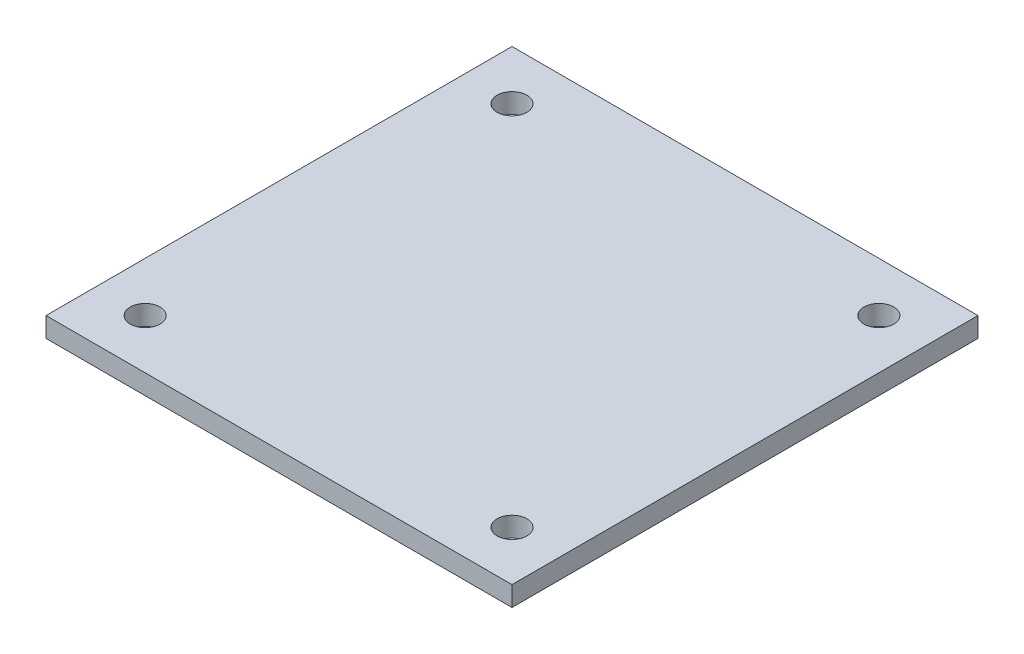
ISO-10303-21;
HEADER;
FILE_DESCRIPTION(('STEP AP214'),'2;1');
FILE_NAME('part.step','',(''),(''),'','','');
FILE_SCHEMA(('AUTOMOTIVE_DESIGN { 1 0 10303 214 1 1 1 1 }'));
ENDSEC;
DATA;
#1=APPLICATION_CONTEXT('core data for automotive mechanical design processes');
#2=APPLICATION_PROTOCOL_DEFINITION('international standard','automotive_design',2000,#1);
#3=PRODUCT_CONTEXT('',#1,'mechanical');
#4=PRODUCT('Part','Part','',(#3));
#5=PRODUCT_RELATED_PRODUCT_CATEGORY('part','',(#4));
#6=PRODUCT_DEFINITION_FORMATION('','',#4);
#7=PRODUCT_DEFINITION_CONTEXT('part definition',#1,'design');
#8=PRODUCT_DEFINITION('design','',#6,#7);
#9=PRODUCT_DEFINITION_SHAPE('','',#8);
#10=(LENGTH_UNIT() NAMED_UNIT(*) SI_UNIT(.MILLI.,.METRE.));
#11=(NAMED_UNIT(*) PLANE_ANGLE_UNIT() SI_UNIT($,.RADIAN.));
#12=(NAMED_UNIT(*) SI_UNIT($,.STERADIAN.) SOLID_ANGLE_UNIT());
#13=UNCERTAINTY_MEASURE_WITH_UNIT(LENGTH_MEASURE(1.E-05),#10,'distance_accuracy_value','');
#14=(GEOMETRIC_REPRESENTATION_CONTEXT(3) GLOBAL_UNCERTAINTY_ASSIGNED_CONTEXT((#13)) GLOBAL_UNIT_ASSIGNED_CONTEXT((#10,
#11,#12)) REPRESENTATION_CONTEXT('',''));
#15=CARTESIAN_POINT('',(0.,0.,0.));
#16=DIRECTION('',(0.,0.,1.));
#17=DIRECTION('',(1.,0.,0.));
#18=AXIS2_PLACEMENT_3D('',#15,#16,#17);
#19=CARTESIAN_POINT('',(-117.5,10.,-117.5));
#20=DIRECTION('',(1.,0.,0.));
#21=DIRECTION('',(0.,0.,-1.));
#22=AXIS2_PLACEMENT_3D('',#19,#20,#21);
#23=PLANE('',#22);
#24=DIRECTION('',(0.,0.,1.));
#25=VECTOR('',#24,1.);
#26=CARTESIAN_POINT('',(-117.5,0.,-117.5));
#27=LINE('',#26,#25);
#28=CARTESIAN_POINT('',(-117.5,0.,-117.5));
#29=VERTEX_POINT('',#28);
#30=CARTESIAN_POINT('',(-117.5,0.,117.5));
#31=VERTEX_POINT('',#30);
#32=EDGE_CURVE('E96',#29,#31,#27,.T.);
#33=ORIENTED_EDGE('',*,*,#32,.T.);
#34=DIRECTION('',(0.,-1.,0.));
#35=VECTOR('',#34,1.);
#36=CARTESIAN_POINT('',(-117.5,10.,117.5));
#37=LINE('',#36,#35);
#38=CARTESIAN_POINT('',(-117.5,10.,117.5));
#39=VERTEX_POINT('',#38);
#40=EDGE_CURVE('E11',#39,#31,#37,.T.);
#41=ORIENTED_EDGE('',*,*,#40,.F.);
#42=DIRECTION('',(0.,0.,1.));
#43=VECTOR('',#42,1.);
#44=CARTESIAN_POINT('',(-117.5,10.,-117.5));
#45=LINE('',#44,#43);
#46=CARTESIAN_POINT('',(-117.5,10.,-117.5));
#47=VERTEX_POINT('',#46);
#48=EDGE_CURVE('E84',#47,#39,#45,.T.);
#49=ORIENTED_EDGE('',*,*,#48,.F.);
#50=DIRECTION('',(0.,-1.,0.));
#51=VECTOR('',#50,1.);
#52=CARTESIAN_POINT('',(-117.5,10.,-117.5));
#53=LINE('',#52,#51);
#54=EDGE_CURVE('E92',#47,#29,#53,.T.);
#55=ORIENTED_EDGE('',*,*,#54,.T.);
#56=EDGE_LOOP('',(#33,#41,#49,#55));
#57=FACE_BOUND('',#56,.T.);
#58=ADVANCED_FACE('F33',(#57),#23,.F.);
#59=CARTESIAN_POINT('',(-117.5,10.,117.5));
#60=DIRECTION('',(0.,0.,-1.));
#61=DIRECTION('',(-1.,0.,0.));
#62=AXIS2_PLACEMENT_3D('',#59,#60,#61);
#63=PLANE('',#62);
#64=DIRECTION('',(1.,0.,0.));
#65=VECTOR('',#64,1.);
#66=CARTESIAN_POINT('',(-117.5,0.,117.5));
#67=LINE('',#66,#65);
#68=CARTESIAN_POINT('',(117.5,0.,117.5));
#69=VERTEX_POINT('',#68);
#70=EDGE_CURVE('E88',#31,#69,#67,.T.);
#71=ORIENTED_EDGE('',*,*,#70,.T.);
#72=DIRECTION('',(0.,-1.,0.));
#73=VECTOR('',#72,1.);
#74=CARTESIAN_POINT('',(117.5,10.,117.5));
#75=LINE('',#74,#73);
#76=CARTESIAN_POINT('',(117.5,10.,117.5));
#77=VERTEX_POINT('',#76);
#78=EDGE_CURVE('E41',#77,#69,#75,.T.);
#79=ORIENTED_EDGE('',*,*,#78,.F.);
#80=DIRECTION('',(1.,0.,0.));
#81=VECTOR('',#80,1.);
#82=CARTESIAN_POINT('',(-117.5,10.,117.5));
#83=LINE('',#82,#81);
#84=EDGE_CURVE('E79',#39,#77,#83,.T.);
#85=ORIENTED_EDGE('',*,*,#84,.F.);
#86=ORIENTED_EDGE('',*,*,#40,.T.);
#87=EDGE_LOOP('',(#71,#79,#85,#86));
#88=FACE_BOUND('',#87,.T.);
#89=ADVANCED_FACE('F87',(#88),#63,.F.);
#90=CARTESIAN_POINT('',(117.5,10.,-117.5));
#91=DIRECTION('',(-1.,0.,0.));
#92=DIRECTION('',(0.,0.,1.));
#93=AXIS2_PLACEMENT_3D('',#90,#91,#92);
#94=PLANE('',#93);
#95=DIRECTION('',(0.,0.,-1.));
#96=VECTOR('',#95,1.);
#97=CARTESIAN_POINT('',(117.5,0.,-117.5));
#98=LINE('',#97,#96);
#99=CARTESIAN_POINT('',(117.5,0.,-117.5));
#100=VERTEX_POINT('',#99);
#101=EDGE_CURVE('E66',#69,#100,#98,.T.);
#102=ORIENTED_EDGE('',*,*,#101,.T.);
#103=DIRECTION('',(0.,-1.,0.));
#104=VECTOR('',#103,1.);
#105=CARTESIAN_POINT('',(117.5,10.,-117.5));
#106=LINE('',#105,#104);
#107=CARTESIAN_POINT('',(117.5,10.,-117.5));
#108=VERTEX_POINT('',#107);
#109=EDGE_CURVE('E89',#108,#100,#106,.T.);
#110=ORIENTED_EDGE('',*,*,#109,.F.);
#111=DIRECTION('',(0.,0.,-1.));
#112=VECTOR('',#111,1.);
#113=CARTESIAN_POINT('',(117.5,10.,-117.5));
#114=LINE('',#113,#112);
#115=EDGE_CURVE('E82',#77,#108,#114,.T.);
#116=ORIENTED_EDGE('',*,*,#115,.F.);
#117=ORIENTED_EDGE('',*,*,#78,.T.);
#118=EDGE_LOOP('',(#102,#110,#116,#117));
#119=FACE_BOUND('',#118,.T.);
#120=ADVANCED_FACE('F90',(#119),#94,.F.);
#121=CARTESIAN_POINT('',(-117.5,10.,-117.5));
#122=DIRECTION('',(0.,0.,1.));
#123=DIRECTION('',(1.,0.,0.));
#124=AXIS2_PLACEMENT_3D('',#121,#122,#123);
#125=PLANE('',#124);
#126=DIRECTION('',(-1.,0.,0.));
#127=VECTOR('',#126,1.);
#128=CARTESIAN_POINT('',(-117.5,0.,-117.5));
#129=LINE('',#128,#127);
#130=EDGE_CURVE('E72',#100,#29,#129,.T.);
#131=ORIENTED_EDGE('',*,*,#130,.T.);
#132=ORIENTED_EDGE('',*,*,#54,.F.);
#133=DIRECTION('',(-1.,0.,0.));
#134=VECTOR('',#133,1.);
#135=CARTESIAN_POINT('',(-117.5,10.,-117.5));
#136=LINE('',#135,#134);
#137=EDGE_CURVE('E49',#108,#47,#136,.T.);
#138=ORIENTED_EDGE('',*,*,#137,.F.);
#139=ORIENTED_EDGE('',*,*,#109,.T.);
#140=EDGE_LOOP('',(#131,#132,#138,#139));
#141=FACE_BOUND('',#140,.T.);
#142=ADVANCED_FACE('F104',(#141),#125,.F.);
#143=CARTESIAN_POINT('',(0.,10.,0.));
#144=DIRECTION('',(0.,1.,0.));
#145=DIRECTION('',(0.,0.,1.));
#146=AXIS2_PLACEMENT_3D('',#143,#144,#145);
#147=PLANE('',#146);
#148=CARTESIAN_POINT('',(92.5,10.,-92.5));
#149=DIRECTION('',(0.,1.,0.));
#150=DIRECTION('',(0.,0.,1.));
#151=AXIS2_PLACEMENT_3D('',#148,#149,#150);
#152=CIRCLE('',#151,7.50000000000001);
#153=CARTESIAN_POINT('',(92.5,10.,-85.));
#154=VERTEX_POINT('',#153);
#155=EDGE_CURVE('E116',#154,#154,#152,.T.);
#156=ORIENTED_EDGE('',*,*,#155,.F.);
#157=EDGE_LOOP('',(#156));
#158=FACE_BOUND('',#157,.T.);
#159=CARTESIAN_POINT('',(92.5,10.,92.5));
#160=DIRECTION('',(0.,1.,0.));
#161=DIRECTION('',(0.,0.,1.));
#162=AXIS2_PLACEMENT_3D('',#159,#160,#161);
#163=CIRCLE('',#162,7.50000000000001);
#164=CARTESIAN_POINT('',(92.5,10.,100.));
#165=VERTEX_POINT('',#164);
#166=EDGE_CURVE('E122',#165,#165,#163,.T.);
#167=ORIENTED_EDGE('',*,*,#166,.F.);
#168=EDGE_LOOP('',(#167));
#169=FACE_BOUND('',#168,.T.);
#170=CARTESIAN_POINT('',(-92.5,10.,92.5));
#171=DIRECTION('',(0.,1.,0.));
#172=DIRECTION('',(0.,0.,1.));
#173=AXIS2_PLACEMENT_3D('',#170,#171,#172);
#174=CIRCLE('',#173,7.50000000000001);
#175=CARTESIAN_POINT('',(-92.5,10.,100.));
#176=VERTEX_POINT('',#175);
#177=EDGE_CURVE('E128',#176,#176,#174,.T.);
#178=ORIENTED_EDGE('',*,*,#177,.F.);
#179=EDGE_LOOP('',(#178));
#180=FACE_BOUND('',#179,.T.);
#181=CARTESIAN_POINT('',(-92.5,10.,-92.5));
#182=DIRECTION('',(0.,1.,0.));
#183=DIRECTION('',(0.,0.,1.));
#184=AXIS2_PLACEMENT_3D('',#181,#182,#183);
#185=CIRCLE('',#184,7.50000000000001);
#186=CARTESIAN_POINT('',(-92.5,10.,-85.));
#187=VERTEX_POINT('',#186);
#188=EDGE_CURVE('E110',#187,#187,#185,.T.);
#189=ORIENTED_EDGE('',*,*,#188,.F.);
#190=EDGE_LOOP('',(#189));
#191=FACE_BOUND('',#190,.T.);
#192=ORIENTED_EDGE('',*,*,#48,.T.);
#193=ORIENTED_EDGE('',*,*,#84,.T.);
#194=ORIENTED_EDGE('',*,*,#115,.T.);
#195=ORIENTED_EDGE('',*,*,#137,.T.);
#196=EDGE_LOOP('',(#192,#193,#194,#195));
#197=FACE_BOUND('',#196,.T.);
#198=ADVANCED_FACE('F80',(#158,#169,#180,#191,#197),#147,.T.);
#199=CARTESIAN_POINT('',(0.,0.,0.));
#200=DIRECTION('',(0.,1.,0.));
#201=DIRECTION('',(0.,0.,1.));
#202=AXIS2_PLACEMENT_3D('',#199,#200,#201);
#203=PLANE('',#202);
#204=CARTESIAN_POINT('',(92.5,0.,-92.5));
#205=DIRECTION('',(0.,1.,0.));
#206=DIRECTION('',(0.,0.,1.));
#207=AXIS2_PLACEMENT_3D('',#204,#205,#206);
#208=CIRCLE('',#207,7.50000000000001);
#209=CARTESIAN_POINT('',(92.5,0.,-85.));
#210=VERTEX_POINT('',#209);
#211=EDGE_CURVE('E119',#210,#210,#208,.T.);
#212=ORIENTED_EDGE('',*,*,#211,.T.);
#213=EDGE_LOOP('',(#212));
#214=FACE_BOUND('',#213,.T.);
#215=CARTESIAN_POINT('',(92.5,0.,92.5));
#216=DIRECTION('',(0.,1.,0.));
#217=DIRECTION('',(0.,0.,1.));
#218=AXIS2_PLACEMENT_3D('',#215,#216,#217);
#219=CIRCLE('',#218,7.50000000000001);
#220=CARTESIAN_POINT('',(92.5,0.,100.));
#221=VERTEX_POINT('',#220);
#222=EDGE_CURVE('E125',#221,#221,#219,.T.);
#223=ORIENTED_EDGE('',*,*,#222,.T.);
#224=EDGE_LOOP('',(#223));
#225=FACE_BOUND('',#224,.T.);
#226=CARTESIAN_POINT('',(-92.5,0.,92.5));
#227=DIRECTION('',(0.,1.,0.));
#228=DIRECTION('',(0.,0.,1.));
#229=AXIS2_PLACEMENT_3D('',#226,#227,#228);
#230=CIRCLE('',#229,7.50000000000001);
#231=CARTESIAN_POINT('',(-92.5,0.,100.));
#232=VERTEX_POINT('',#231);
#233=EDGE_CURVE('E113',#232,#232,#230,.T.);
#234=ORIENTED_EDGE('',*,*,#233,.T.);
#235=EDGE_LOOP('',(#234));
#236=FACE_BOUND('',#235,.T.);
#237=CARTESIAN_POINT('',(-92.5,0.,-92.5));
#238=DIRECTION('',(0.,1.,0.));
#239=DIRECTION('',(0.,0.,1.));
#240=AXIS2_PLACEMENT_3D('',#237,#238,#239);
#241=CIRCLE('',#240,7.50000000000001);
#242=CARTESIAN_POINT('',(-92.5,0.,-85.));
#243=VERTEX_POINT('',#242);
#244=EDGE_CURVE('E99',#243,#243,#241,.T.);
#245=ORIENTED_EDGE('',*,*,#244,.T.);
#246=EDGE_LOOP('',(#245));
#247=FACE_BOUND('',#246,.T.);
#248=ORIENTED_EDGE('',*,*,#32,.F.);
#249=ORIENTED_EDGE('',*,*,#130,.F.);
#250=ORIENTED_EDGE('',*,*,#101,.F.);
#251=ORIENTED_EDGE('',*,*,#70,.F.);
#252=EDGE_LOOP('',(#248,#249,#250,#251));
#253=FACE_BOUND('',#252,.T.);
#254=ADVANCED_FACE('F107',(#214,#225,#236,#247,#253),#203,.F.);
#255=CARTESIAN_POINT('',(-92.5,0.,-92.5));
#256=DIRECTION('',(0.,1.,0.));
#257=DIRECTION('',(0.,0.,1.));
#258=AXIS2_PLACEMENT_3D('',#255,#256,#257);
#259=CYLINDRICAL_SURFACE('',#258,7.50000000000001);
#260=ORIENTED_EDGE('',*,*,#244,.F.);
#261=EDGE_LOOP('',(#260));
#262=FACE_BOUND('',#261,.T.);
#263=ORIENTED_EDGE('',*,*,#188,.T.);
#264=EDGE_LOOP('',(#263));
#265=FACE_BOUND('',#264,.T.);
#266=ADVANCED_FACE('F140',(#262,#265),#259,.F.);
#267=CARTESIAN_POINT('',(-92.5,0.,92.5));
#268=DIRECTION('',(0.,1.,0.));
#269=DIRECTION('',(0.,0.,1.));
#270=AXIS2_PLACEMENT_3D('',#267,#268,#269);
#271=CYLINDRICAL_SURFACE('',#270,7.50000000000001);
#272=ORIENTED_EDGE('',*,*,#233,.F.);
#273=EDGE_LOOP('',(#272));
#274=FACE_BOUND('',#273,.T.);
#275=ORIENTED_EDGE('',*,*,#177,.T.);
#276=EDGE_LOOP('',(#275));
#277=FACE_BOUND('',#276,.T.);
#278=ADVANCED_FACE('F136',(#274,#277),#271,.F.);
#279=CARTESIAN_POINT('',(92.5,0.,92.5));
#280=DIRECTION('',(0.,1.,0.));
#281=DIRECTION('',(0.,0.,1.));
#282=AXIS2_PLACEMENT_3D('',#279,#280,#281);
#283=CYLINDRICAL_SURFACE('',#282,7.50000000000001);
#284=ORIENTED_EDGE('',*,*,#222,.F.);
#285=EDGE_LOOP('',(#284));
#286=FACE_BOUND('',#285,.T.);
#287=ORIENTED_EDGE('',*,*,#166,.T.);
#288=EDGE_LOOP('',(#287));
#289=FACE_BOUND('',#288,.T.);
#290=ADVANCED_FACE('F139',(#286,#289),#283,.F.);
#291=CARTESIAN_POINT('',(92.5,0.,-92.5));
#292=DIRECTION('',(0.,1.,0.));
#293=DIRECTION('',(0.,0.,1.));
#294=AXIS2_PLACEMENT_3D('',#291,#292,#293);
#295=CYLINDRICAL_SURFACE('',#294,7.50000000000001);
#296=ORIENTED_EDGE('',*,*,#211,.F.);
#297=EDGE_LOOP('',(#296));
#298=FACE_BOUND('',#297,.T.);
#299=ORIENTED_EDGE('',*,*,#155,.T.);
#300=EDGE_LOOP('',(#299));
#301=FACE_BOUND('',#300,.T.);
#302=ADVANCED_FACE('F201',(#298,#301),#295,.F.);
#303=CLOSED_SHELL('',(#58,#89,#120,#142,#198,#254,#266,#278,#290,#302));
#304=MANIFOLD_SOLID_BREP('B2',#303);
#305=ADVANCED_BREP_SHAPE_REPRESENTATION('',(#18,#304),#14);
#306=SHAPE_DEFINITION_REPRESENTATION(#9,#305);
ENDSEC;
END-ISO-10303-21;
